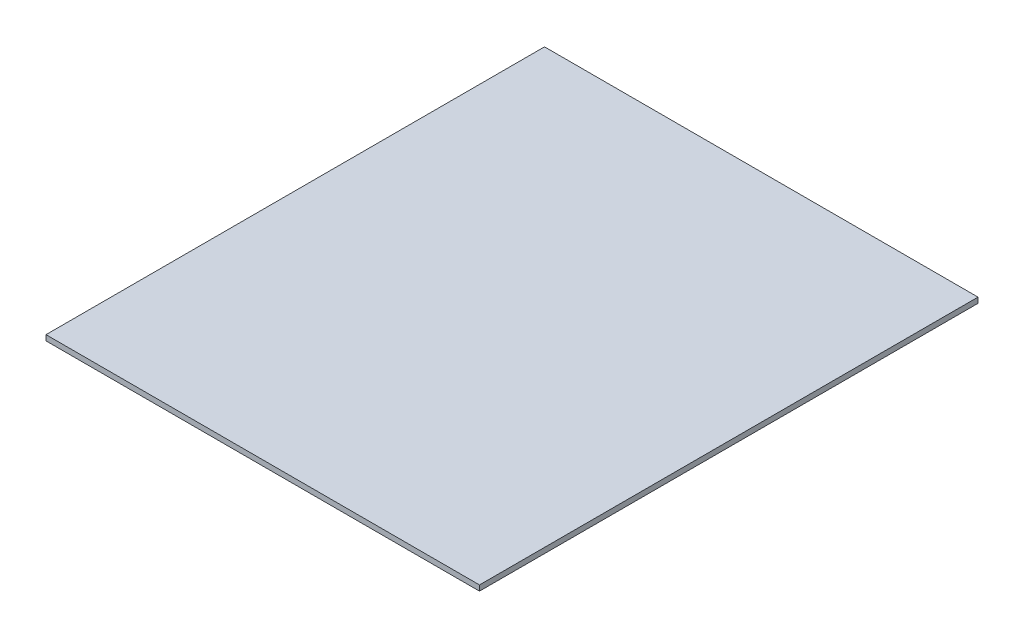
ISO-10303-21;
HEADER;
FILE_DESCRIPTION(('STEP AP214'),'2;1');
FILE_NAME('part.step','',(''),(''),'','','');
FILE_SCHEMA(('AUTOMOTIVE_DESIGN { 1 0 10303 214 1 1 1 1 }'));
ENDSEC;
DATA;
#1=APPLICATION_CONTEXT('core data for automotive mechanical design processes');
#2=APPLICATION_PROTOCOL_DEFINITION('international standard','automotive_design',2000,#1);
#3=PRODUCT_CONTEXT('',#1,'mechanical');
#4=PRODUCT('Part','Part','',(#3));
#5=PRODUCT_RELATED_PRODUCT_CATEGORY('part','',(#4));
#6=PRODUCT_DEFINITION_FORMATION('','',#4);
#7=PRODUCT_DEFINITION_CONTEXT('part definition',#1,'design');
#8=PRODUCT_DEFINITION('design','',#6,#7);
#9=PRODUCT_DEFINITION_SHAPE('','',#8);
#10=(LENGTH_UNIT() NAMED_UNIT(*) SI_UNIT(.MILLI.,.METRE.));
#11=(NAMED_UNIT(*) PLANE_ANGLE_UNIT() SI_UNIT($,.RADIAN.));
#12=(NAMED_UNIT(*) SI_UNIT($,.STERADIAN.) SOLID_ANGLE_UNIT());
#13=UNCERTAINTY_MEASURE_WITH_UNIT(LENGTH_MEASURE(1.E-05),#10,'distance_accuracy_value','');
#14=(GEOMETRIC_REPRESENTATION_CONTEXT(3) GLOBAL_UNCERTAINTY_ASSIGNED_CONTEXT((#13)) GLOBAL_UNIT_ASSIGNED_CONTEXT((#10,
#11,#12)) REPRESENTATION_CONTEXT('',''));
#15=CARTESIAN_POINT('',(0.,0.,0.));
#16=DIRECTION('',(0.,0.,1.));
#17=DIRECTION('',(1.,0.,0.));
#18=AXIS2_PLACEMENT_3D('',#15,#16,#17);
#19=CARTESIAN_POINT('',(0.,3.175,0.));
#20=DIRECTION('',(1.,0.,0.));
#21=DIRECTION('',(0.,0.,-1.));
#22=AXIS2_PLACEMENT_3D('',#19,#20,#21);
#23=PLANE('',#22);
#24=DIRECTION('',(0.,0.,1.));
#25=VECTOR('',#24,1.);
#26=CARTESIAN_POINT('',(0.,0.,0.));
#27=LINE('',#26,#25);
#28=CARTESIAN_POINT('',(0.,0.,-292.1));
#29=VERTEX_POINT('',#28);
#30=CARTESIAN_POINT('',(0.,0.,0.));
#31=VERTEX_POINT('',#30);
#32=EDGE_CURVE('E96',#29,#31,#27,.T.);
#33=ORIENTED_EDGE('',*,*,#32,.T.);
#34=DIRECTION('',(0.,-1.,0.));
#35=VECTOR('',#34,1.);
#36=CARTESIAN_POINT('',(0.,3.175,0.));
#37=LINE('',#36,#35);
#38=CARTESIAN_POINT('',(0.,3.175,0.));
#39=VERTEX_POINT('',#38);
#40=EDGE_CURVE('E11',#39,#31,#37,.T.);
#41=ORIENTED_EDGE('',*,*,#40,.F.);
#42=DIRECTION('',(0.,0.,1.));
#43=VECTOR('',#42,1.);
#44=CARTESIAN_POINT('',(0.,3.175,0.));
#45=LINE('',#44,#43);
#46=CARTESIAN_POINT('',(0.,3.175,-292.1));
#47=VERTEX_POINT('',#46);
#48=EDGE_CURVE('E84',#47,#39,#45,.T.);
#49=ORIENTED_EDGE('',*,*,#48,.F.);
#50=DIRECTION('',(0.,-1.,0.));
#51=VECTOR('',#50,1.);
#52=CARTESIAN_POINT('',(0.,3.175,-292.1));
#53=LINE('',#52,#51);
#54=EDGE_CURVE('E92',#47,#29,#53,.T.);
#55=ORIENTED_EDGE('',*,*,#54,.T.);
#56=EDGE_LOOP('',(#33,#41,#49,#55));
#57=FACE_BOUND('',#56,.T.);
#58=ADVANCED_FACE('F33',(#57),#23,.F.);
#59=CARTESIAN_POINT('',(0.,3.175,0.));
#60=DIRECTION('',(0.,0.,-1.));
#61=DIRECTION('',(-1.,0.,0.));
#62=AXIS2_PLACEMENT_3D('',#59,#60,#61);
#63=PLANE('',#62);
#64=DIRECTION('',(1.,0.,0.));
#65=VECTOR('',#64,1.);
#66=CARTESIAN_POINT('',(0.,0.,0.));
#67=LINE('',#66,#65);
#68=CARTESIAN_POINT('',(254.,0.,0.));
#69=VERTEX_POINT('',#68);
#70=EDGE_CURVE('E88',#31,#69,#67,.T.);
#71=ORIENTED_EDGE('',*,*,#70,.T.);
#72=DIRECTION('',(0.,-1.,0.));
#73=VECTOR('',#72,1.);
#74=CARTESIAN_POINT('',(254.,3.175,0.));
#75=LINE('',#74,#73);
#76=CARTESIAN_POINT('',(254.,3.175,0.));
#77=VERTEX_POINT('',#76);
#78=EDGE_CURVE('E41',#77,#69,#75,.T.);
#79=ORIENTED_EDGE('',*,*,#78,.F.);
#80=DIRECTION('',(1.,0.,0.));
#81=VECTOR('',#80,1.);
#82=CARTESIAN_POINT('',(0.,3.175,0.));
#83=LINE('',#82,#81);
#84=EDGE_CURVE('E79',#39,#77,#83,.T.);
#85=ORIENTED_EDGE('',*,*,#84,.F.);
#86=ORIENTED_EDGE('',*,*,#40,.T.);
#87=EDGE_LOOP('',(#71,#79,#85,#86));
#88=FACE_BOUND('',#87,.T.);
#89=ADVANCED_FACE('F87',(#88),#63,.F.);
#90=CARTESIAN_POINT('',(254.,3.175,0.));
#91=DIRECTION('',(-1.,0.,0.));
#92=DIRECTION('',(0.,0.,1.));
#93=AXIS2_PLACEMENT_3D('',#90,#91,#92);
#94=PLANE('',#93);
#95=DIRECTION('',(0.,0.,-1.));
#96=VECTOR('',#95,1.);
#97=CARTESIAN_POINT('',(254.,0.,0.));
#98=LINE('',#97,#96);
#99=CARTESIAN_POINT('',(254.,0.,-292.1));
#100=VERTEX_POINT('',#99);
#101=EDGE_CURVE('E66',#69,#100,#98,.T.);
#102=ORIENTED_EDGE('',*,*,#101,.T.);
#103=DIRECTION('',(0.,-1.,0.));
#104=VECTOR('',#103,1.);
#105=CARTESIAN_POINT('',(254.,3.175,-292.1));
#106=LINE('',#105,#104);
#107=CARTESIAN_POINT('',(254.,3.175,-292.1));
#108=VERTEX_POINT('',#107);
#109=EDGE_CURVE('E89',#108,#100,#106,.T.);
#110=ORIENTED_EDGE('',*,*,#109,.F.);
#111=DIRECTION('',(0.,0.,-1.));
#112=VECTOR('',#111,1.);
#113=CARTESIAN_POINT('',(254.,3.175,0.));
#114=LINE('',#113,#112);
#115=EDGE_CURVE('E82',#77,#108,#114,.T.);
#116=ORIENTED_EDGE('',*,*,#115,.F.);
#117=ORIENTED_EDGE('',*,*,#78,.T.);
#118=EDGE_LOOP('',(#102,#110,#116,#117));
#119=FACE_BOUND('',#118,.T.);
#120=ADVANCED_FACE('F90',(#119),#94,.F.);
#121=CARTESIAN_POINT('',(0.,3.175,-292.1));
#122=DIRECTION('',(0.,0.,1.));
#123=DIRECTION('',(1.,0.,0.));
#124=AXIS2_PLACEMENT_3D('',#121,#122,#123);
#125=PLANE('',#124);
#126=DIRECTION('',(-1.,0.,0.));
#127=VECTOR('',#126,1.);
#128=CARTESIAN_POINT('',(0.,0.,-292.1));
#129=LINE('',#128,#127);
#130=EDGE_CURVE('E72',#100,#29,#129,.T.);
#131=ORIENTED_EDGE('',*,*,#130,.T.);
#132=ORIENTED_EDGE('',*,*,#54,.F.);
#133=DIRECTION('',(-1.,0.,0.));
#134=VECTOR('',#133,1.);
#135=CARTESIAN_POINT('',(0.,3.175,-292.1));
#136=LINE('',#135,#134);
#137=EDGE_CURVE('E49',#108,#47,#136,.T.);
#138=ORIENTED_EDGE('',*,*,#137,.F.);
#139=ORIENTED_EDGE('',*,*,#109,.T.);
#140=EDGE_LOOP('',(#131,#132,#138,#139));
#141=FACE_BOUND('',#140,.T.);
#142=ADVANCED_FACE('F103',(#141),#125,.F.);
#143=CARTESIAN_POINT('',(0.,3.175,0.));
#144=DIRECTION('',(0.,-1.,0.));
#145=DIRECTION('',(0.,0.,-1.));
#146=AXIS2_PLACEMENT_3D('',#143,#144,#145);
#147=PLANE('',#146);
#148=ORIENTED_EDGE('',*,*,#48,.T.);
#149=ORIENTED_EDGE('',*,*,#84,.T.);
#150=ORIENTED_EDGE('',*,*,#115,.T.);
#151=ORIENTED_EDGE('',*,*,#137,.T.);
#152=EDGE_LOOP('',(#148,#149,#150,#151));
#153=FACE_BOUND('',#152,.T.);
#154=ADVANCED_FACE('F80',(#153),#147,.F.);
#155=CARTESIAN_POINT('',(0.,0.,0.));
#156=DIRECTION('',(0.,-1.,0.));
#157=DIRECTION('',(0.,0.,-1.));
#158=AXIS2_PLACEMENT_3D('',#155,#156,#157);
#159=PLANE('',#158);
#160=ORIENTED_EDGE('',*,*,#32,.F.);
#161=ORIENTED_EDGE('',*,*,#130,.F.);
#162=ORIENTED_EDGE('',*,*,#101,.F.);
#163=ORIENTED_EDGE('',*,*,#70,.F.);
#164=EDGE_LOOP('',(#160,#161,#162,#163));
#165=FACE_BOUND('',#164,.T.);
#166=ADVANCED_FACE('F106',(#165),#159,.T.);
#167=CLOSED_SHELL('',(#58,#89,#120,#142,#154,#166));
#168=MANIFOLD_SOLID_BREP('B2',#167);
#169=ADVANCED_BREP_SHAPE_REPRESENTATION('',(#18,#168),#14);
#170=SHAPE_DEFINITION_REPRESENTATION(#9,#169);
ENDSEC;
END-ISO-10303-21;
